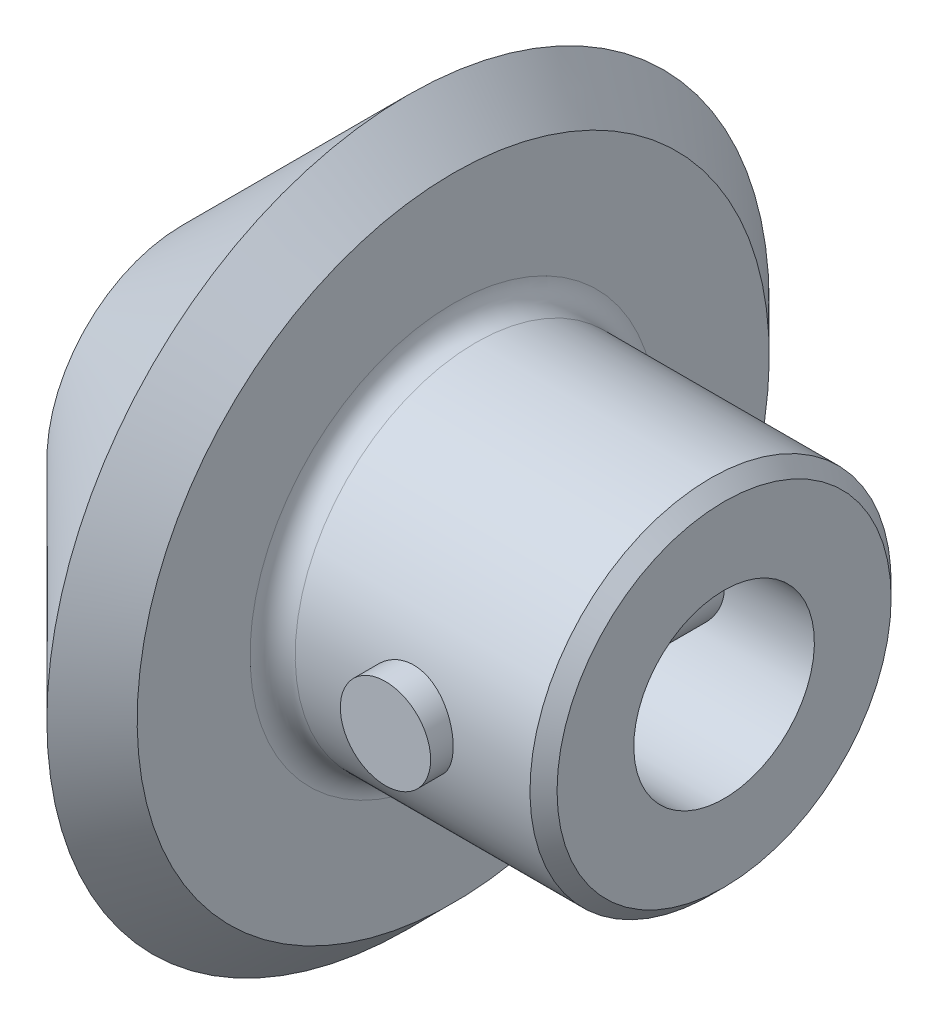
ISO-10303-21;
HEADER;
FILE_DESCRIPTION(('STEP AP214'),'2;1');
FILE_NAME('part.step','',(''),(''),'','','');
FILE_SCHEMA(('AUTOMOTIVE_DESIGN { 1 0 10303 214 1 1 1 1 }'));
ENDSEC;
DATA;
#1=APPLICATION_CONTEXT('core data for automotive mechanical design processes');
#2=APPLICATION_PROTOCOL_DEFINITION('international standard','automotive_design',2000,#1);
#3=PRODUCT_CONTEXT('',#1,'mechanical');
#4=PRODUCT('Part','Part','',(#3));
#5=PRODUCT_RELATED_PRODUCT_CATEGORY('part','',(#4));
#6=PRODUCT_DEFINITION_FORMATION('','',#4);
#7=PRODUCT_DEFINITION_CONTEXT('part definition',#1,'design');
#8=PRODUCT_DEFINITION('design','',#6,#7);
#9=PRODUCT_DEFINITION_SHAPE('','',#8);
#10=(LENGTH_UNIT() NAMED_UNIT(*) SI_UNIT(.MILLI.,.METRE.));
#11=(NAMED_UNIT(*) PLANE_ANGLE_UNIT() SI_UNIT($,.RADIAN.));
#12=(NAMED_UNIT(*) SI_UNIT($,.STERADIAN.) SOLID_ANGLE_UNIT());
#13=UNCERTAINTY_MEASURE_WITH_UNIT(LENGTH_MEASURE(1.E-05),#10,'distance_accuracy_value','');
#14=(GEOMETRIC_REPRESENTATION_CONTEXT(3) GLOBAL_UNCERTAINTY_ASSIGNED_CONTEXT((#13)) GLOBAL_UNIT_ASSIGNED_CONTEXT((#10,
#11,#12)) REPRESENTATION_CONTEXT('',''));
#15=CARTESIAN_POINT('',(0.,0.,0.));
#16=DIRECTION('',(0.,0.,1.));
#17=DIRECTION('',(1.,0.,0.));
#18=AXIS2_PLACEMENT_3D('',#15,#16,#17);
#19=CARTESIAN_POINT('',(9.,0.,4.5));
#20=DIRECTION('',(0.,0.,-1.));
#21=DIRECTION('',(-1.,0.,0.));
#22=AXIS2_PLACEMENT_3D('',#19,#20,#21);
#23=CYLINDRICAL_SURFACE('',#22,1.);
#24=CARTESIAN_POINT('',(9.,0.,4.5));
#25=DIRECTION('',(0.,0.,1.));
#26=DIRECTION('',(1.,0.,0.));
#27=AXIS2_PLACEMENT_3D('',#24,#25,#26);
#28=CIRCLE('',#27,1.);
#29=CARTESIAN_POINT('',(10.,0.,4.5));
#30=VERTEX_POINT('',#29);
#31=EDGE_CURVE('E11',#30,#30,#28,.T.);
#32=ORIENTED_EDGE('',*,*,#31,.F.);
#33=EDGE_LOOP('',(#32));
#34=FACE_BOUND('',#33,.T.);
#35=CARTESIAN_POINT('',(9.,0.,-4.5));
#36=DIRECTION('',(0.,0.,1.));
#37=DIRECTION('',(1.,0.,0.));
#38=AXIS2_PLACEMENT_3D('',#35,#36,#37);
#39=CIRCLE('',#38,1.);
#40=CARTESIAN_POINT('',(10.,0.,-4.5));
#41=VERTEX_POINT('',#40);
#42=EDGE_CURVE('E54',#41,#41,#39,.T.);
#43=ORIENTED_EDGE('',*,*,#42,.T.);
#44=EDGE_LOOP('',(#43));
#45=FACE_BOUND('',#44,.T.);
#46=ADVANCED_FACE('F51',(#34,#45),#23,.T.);
#47=CARTESIAN_POINT('',(9.,0.,4.5));
#48=DIRECTION('',(0.,0.,1.));
#49=DIRECTION('',(1.,0.,0.));
#50=AXIS2_PLACEMENT_3D('',#47,#48,#49);
#51=PLANE('',#50);
#52=ORIENTED_EDGE('',*,*,#31,.T.);
#53=EDGE_LOOP('',(#52));
#54=FACE_BOUND('',#53,.T.);
#55=ADVANCED_FACE('F66',(#54),#51,.T.);
#56=CARTESIAN_POINT('',(9.,0.,-4.5));
#57=DIRECTION('',(0.,0.,1.));
#58=DIRECTION('',(1.,0.,0.));
#59=AXIS2_PLACEMENT_3D('',#56,#57,#58);
#60=PLANE('',#59);
#61=ORIENTED_EDGE('',*,*,#42,.F.);
#62=EDGE_LOOP('',(#61));
#63=FACE_BOUND('',#62,.T.);
#64=ADVANCED_FACE('F64',(#63),#60,.F.);
#65=CLOSED_SHELL('',(#46,#55,#64));
#66=MANIFOLD_SOLID_BREP('B2',#65);
#67=CARTESIAN_POINT('',(0.,0.,0.));
#68=DIRECTION('',(-1.,0.,0.));
#69=DIRECTION('',(0.,-1.,0.));
#70=AXIS2_PLACEMENT_3D('',#67,#68,#69);
#71=PLANE('',#70);
#72=CARTESIAN_POINT('',(0.,0.,0.));
#73=DIRECTION('',(-1.,0.,0.));
#74=DIRECTION('',(0.,-1.,0.));
#75=AXIS2_PLACEMENT_3D('',#72,#73,#74);
#76=CIRCLE('',#75,1.5);
#77=CARTESIAN_POINT('',(0.,-1.5,0.));
#78=VERTEX_POINT('',#77);
#79=EDGE_CURVE('E222',#78,#78,#76,.T.);
#80=ORIENTED_EDGE('',*,*,#79,.F.);
#81=EDGE_LOOP('',(#80));
#82=FACE_BOUND('',#81,.T.);
#83=CARTESIAN_POINT('',(0.,0.,0.));
#84=DIRECTION('',(1.,0.,0.));
#85=DIRECTION('',(0.,1.,0.));
#86=AXIS2_PLACEMENT_3D('',#83,#84,#85);
#87=CIRCLE('',#86,3.00000000000002);
#88=CARTESIAN_POINT('',(0.,3.00000000000002,0.));
#89=VERTEX_POINT('',#88);
#90=EDGE_CURVE('E118',#89,#89,#87,.T.);
#91=ORIENTED_EDGE('',*,*,#90,.F.);
#92=EDGE_LOOP('',(#91));
#93=FACE_BOUND('',#92,.T.);
#94=ADVANCED_FACE('F97',(#82,#93),#71,.T.);
#95=CARTESIAN_POINT('',(5.,0.,0.));
#96=DIRECTION('',(1.,0.,0.));
#97=DIRECTION('',(0.,1.,0.));
#98=AXIS2_PLACEMENT_3D('',#95,#96,#97);
#99=CONICAL_SURFACE('',#98,8.,0.785398163397446);
#100=ORIENTED_EDGE('',*,*,#90,.T.);
#101=EDGE_LOOP('',(#100));
#102=FACE_BOUND('',#101,.T.);
#103=CARTESIAN_POINT('',(5.,0.,0.));
#104=DIRECTION('',(1.,0.,0.));
#105=DIRECTION('',(0.,1.,0.));
#106=AXIS2_PLACEMENT_3D('',#103,#104,#105);
#107=CIRCLE('',#106,8.);
#108=CARTESIAN_POINT('',(5.,8.,0.));
#109=VERTEX_POINT('',#108);
#110=EDGE_CURVE('E228',#109,#109,#107,.T.);
#111=ORIENTED_EDGE('',*,*,#110,.F.);
#112=EDGE_LOOP('',(#111));
#113=FACE_BOUND('',#112,.T.);
#114=ADVANCED_FACE('F176',(#102,#113),#99,.T.);
#115=CARTESIAN_POINT('',(6.,0.,0.));
#116=DIRECTION('',(-1.,0.,0.));
#117=DIRECTION('',(0.,-1.,0.));
#118=AXIS2_PLACEMENT_3D('',#115,#116,#117);
#119=CONICAL_SURFACE('',#118,7.,0.785398163397446);
#120=ORIENTED_EDGE('',*,*,#110,.T.);
#121=EDGE_LOOP('',(#120));
#122=FACE_BOUND('',#121,.T.);
#123=CARTESIAN_POINT('',(6.,0.,0.));
#124=DIRECTION('',(1.,0.,0.));
#125=DIRECTION('',(0.,1.,0.));
#126=AXIS2_PLACEMENT_3D('',#123,#124,#125);
#127=CIRCLE('',#126,7.);
#128=CARTESIAN_POINT('',(6.,7.,0.));
#129=VERTEX_POINT('',#128);
#130=EDGE_CURVE('E225',#129,#129,#127,.T.);
#131=ORIENTED_EDGE('',*,*,#130,.F.);
#132=EDGE_LOOP('',(#131));
#133=FACE_BOUND('',#132,.T.);
#134=ADVANCED_FACE('F172',(#122,#133),#119,.T.);
#135=CARTESIAN_POINT('',(6.,7.,0.));
#136=DIRECTION('',(1.,0.,0.));
#137=DIRECTION('',(0.,1.,0.));
#138=AXIS2_PLACEMENT_3D('',#135,#136,#137);
#139=PLANE('',#138);
#140=CARTESIAN_POINT('',(6.,0.,0.));
#141=DIRECTION('',(1.,0.,0.));
#142=DIRECTION('',(0.,1.,0.));
#143=AXIS2_PLACEMENT_3D('',#140,#141,#142);
#144=CIRCLE('',#143,4.5);
#145=CARTESIAN_POINT('',(6.,4.5,0.));
#146=VERTEX_POINT('',#145);
#147=EDGE_CURVE('E109',#146,#146,#144,.F.);
#148=ORIENTED_EDGE('',*,*,#147,.T.);
#149=EDGE_LOOP('',(#148));
#150=FACE_BOUND('',#149,.T.);
#151=ORIENTED_EDGE('',*,*,#130,.T.);
#152=EDGE_LOOP('',(#151));
#153=FACE_BOUND('',#152,.T.);
#154=ADVANCED_FACE('F168',(#150,#153),#139,.T.);
#155=CARTESIAN_POINT('',(10.,0.,0.));
#156=DIRECTION('',(-1.,0.,0.));
#157=DIRECTION('',(0.,-1.,0.));
#158=AXIS2_PLACEMENT_3D('',#155,#156,#157);
#159=CYLINDRICAL_SURFACE('',#158,1.5);
#160=CARTESIAN_POINT('',(6.,0.,0.));
#161=DIRECTION('',(1.,0.,0.));
#162=DIRECTION('',(0.,1.,0.));
#163=AXIS2_PLACEMENT_3D('',#160,#161,#162);
#164=CIRCLE('',#163,1.5);
#165=CARTESIAN_POINT('',(6.,1.5,0.));
#166=VERTEX_POINT('',#165);
#167=EDGE_CURVE('E218',#166,#166,#164,.F.);
#168=ORIENTED_EDGE('',*,*,#167,.F.);
#169=EDGE_LOOP('',(#168));
#170=FACE_BOUND('',#169,.T.);
#171=ORIENTED_EDGE('',*,*,#79,.T.);
#172=EDGE_LOOP('',(#171));
#173=FACE_BOUND('',#172,.T.);
#174=ADVANCED_FACE('F164',(#170,#173),#159,.F.);
#175=CARTESIAN_POINT('',(12.,0.,0.));
#176=DIRECTION('',(-1.,0.,0.));
#177=DIRECTION('',(0.,-1.,0.));
#178=AXIS2_PLACEMENT_3D('',#175,#176,#177);
#179=CYLINDRICAL_SURFACE('',#178,4.);
#180=CARTESIAN_POINT('',(11.7,0.,0.));
#181=DIRECTION('',(1.,0.,0.));
#182=DIRECTION('',(0.,1.,0.));
#183=AXIS2_PLACEMENT_3D('',#180,#181,#182);
#184=CIRCLE('',#183,4.);
#185=CARTESIAN_POINT('',(11.7,4.,0.));
#186=VERTEX_POINT('',#185);
#187=EDGE_CURVE('E50',#186,#186,#184,.F.);
#188=ORIENTED_EDGE('',*,*,#187,.T.);
#189=EDGE_LOOP('',(#188));
#190=FACE_BOUND('',#189,.T.);
#191=CARTESIAN_POINT('',(6.5,0.,0.));
#192=DIRECTION('',(1.,0.,0.));
#193=DIRECTION('',(0.,1.,0.));
#194=AXIS2_PLACEMENT_3D('',#191,#192,#193);
#195=CIRCLE('',#194,4.);
#196=CARTESIAN_POINT('',(6.5,4.,0.));
#197=VERTEX_POINT('',#196);
#198=EDGE_CURVE('E113',#197,#197,#195,.T.);
#199=ORIENTED_EDGE('',*,*,#198,.T.);
#200=EDGE_LOOP('',(#199));
#201=FACE_BOUND('',#200,.T.);
#202=CARTESIAN_POINT('',(10.,0.,-4.));
#203=CARTESIAN_POINT('',(9.9999984495079,0.0552507257798208,-3.99999906578675));
#204=CARTESIAN_POINT('',(9.99540563281748,0.110518771887176,-3.99884385421219));
#205=CARTESIAN_POINT('',(9.977183232462,0.219470882513689,-3.99434742553261));
#206=CARTESIAN_POINT('',(9.96354852697477,0.273154031247159,-3.99100496946646));
#207=CARTESIAN_POINT('',(9.92770716435861,0.377347248121718,-3.98250417554693));
#208=CARTESIAN_POINT('',(9.90551080085648,0.42786104228667,-3.97734801894725));
#209=CARTESIAN_POINT('',(9.85321240663678,0.524448087936285,-3.96576895871729));
#210=CARTESIAN_POINT('',(9.82311010925404,0.57052118956584,-3.95934601236034));
#211=CARTESIAN_POINT('',(9.75519947356386,0.657867951533947,-3.94578275727868));
#212=CARTESIAN_POINT('',(9.71725895002722,0.699037126707382,-3.93863138099022));
#213=CARTESIAN_POINT('',(9.63503186339406,0.774499284802204,-3.92449080078353));
#214=CARTESIAN_POINT('',(9.59074458470234,0.808791491299424,-3.91750161525566));
#215=CARTESIAN_POINT('',(9.49626984884171,0.870017695199356,-3.9043651713314));
#216=CARTESIAN_POINT('',(9.44600451279306,0.896834810616906,-3.89823196313737));
#217=CARTESIAN_POINT('',(9.34150105889443,0.941597939033686,-3.88766329874815));
#218=CARTESIAN_POINT('',(9.28726357778283,0.95954537029289,-3.88322757115192));
#219=CARTESIAN_POINT('',(9.17750433453168,0.985703224536195,-3.87666984478367));
#220=CARTESIAN_POINT('',(9.12203006930013,0.994101512222227,-3.87450327383617));
#221=CARTESIAN_POINT('',(9.01042095399068,1.00150785004524,-3.8725957502516));
#222=CARTESIAN_POINT('',(8.95428621286759,1.00051742787865,-3.87285440299096));
#223=CARTESIAN_POINT('',(8.84438946150368,0.989324349759522,-3.87572803664412));
#224=CARTESIAN_POINT('',(8.79060291902327,0.979345560127015,-3.87828575334586));
#225=CARTESIAN_POINT('',(8.68549263272581,0.950816124602073,-3.88537806450989));
#226=CARTESIAN_POINT('',(8.63416906464735,0.932264868046284,-3.88991279980464));
#227=CARTESIAN_POINT('',(8.53484132249863,0.886926318624771,-3.90050075936124));
#228=CARTESIAN_POINT('',(8.48687588547363,0.860057778155276,-3.90656884979614));
#229=CARTESIAN_POINT('',(8.39605419349544,0.798904184009971,-3.91953140564257));
#230=CARTESIAN_POINT('',(8.35319883462183,0.764617832539227,-3.9264260155649));
#231=CARTESIAN_POINT('',(8.2725309228704,0.688442283120812,-3.94050587026521));
#232=CARTESIAN_POINT('',(8.23489700662577,0.646364172110574,-3.94769379651981));
#233=CARTESIAN_POINT('',(8.1671858383574,0.556407945002467,-3.96137310385857));
#234=CARTESIAN_POINT('',(8.13710881715762,0.508529651805297,-3.96786446366277));
#235=CARTESIAN_POINT('',(8.08529960918374,0.408077259120929,-3.97945154729455));
#236=CARTESIAN_POINT('',(8.06359643983038,0.355487595472417,-3.9845424008515));
#237=CARTESIAN_POINT('',(8.02938846286028,0.247250672095256,-3.99271944660946));
#238=CARTESIAN_POINT('',(8.01688189572124,0.191603999433658,-3.99580602226187));
#239=CARTESIAN_POINT('',(8.00169495629411,0.0803599802600187,-3.9995699951425));
#240=CARTESIAN_POINT('',(7.9987713159498,0.0247978133254738,-4.00030702338852));
#241=CARTESIAN_POINT('',(8.00216600137032,-0.0860219165343384,-3.999458698763));
#242=CARTESIAN_POINT('',(8.00848349519942,-0.14127950642973,-3.99787355494564));
#243=CARTESIAN_POINT('',(8.02998060559425,-0.249076179184328,-3.99259720751571));
#244=CARTESIAN_POINT('',(8.04502750898466,-0.301643412645836,-3.98893756123874));
#245=CARTESIAN_POINT('',(8.08340472268563,-0.403504861635008,-3.97992471089423));
#246=CARTESIAN_POINT('',(8.10673586954211,-0.452798746021757,-3.97457133579928));
#247=CARTESIAN_POINT('',(8.16149075258315,-0.547682089619899,-3.96262205284207));
#248=CARTESIAN_POINT('',(8.19305074159784,-0.59319029455722,-3.95600578244621));
#249=CARTESIAN_POINT('',(8.26319327253131,-0.678351075762164,-3.94229672791613));
#250=CARTESIAN_POINT('',(8.30177702641127,-0.718002639315339,-3.93520386167803));
#251=CARTESIAN_POINT('',(8.38600130722964,-0.791327045381821,-3.92112637973847));
#252=CARTESIAN_POINT('',(8.43179180200162,-0.824829245081355,-3.91414869458187));
#253=CARTESIAN_POINT('',(8.52848842297715,-0.883673839341799,-3.90128585584826));
#254=CARTESIAN_POINT('',(8.57939432197317,-0.909016596105292,-3.89540065378017));
#255=CARTESIAN_POINT('',(8.68460381494205,-0.950634280406196,-3.88545396489777));
#256=CARTESIAN_POINT('',(8.73888508556267,-0.966962931102711,-3.88138170194604));
#257=CARTESIAN_POINT('',(8.84953975859274,-0.990230439969187,-3.87551162726789));
#258=CARTESIAN_POINT('',(8.90591270068833,-0.99717135165244,-3.87371331813291));
#259=CARTESIAN_POINT('',(9.01741401590347,-1.00135906022266,-3.87263267469304));
#260=CARTESIAN_POINT('',(9.07253162341649,-0.99887859852008,-3.87327955152176));
#261=CARTESIAN_POINT('',(9.18153592577866,-0.984918185541913,-3.87685272671895));
#262=CARTESIAN_POINT('',(9.23542264534244,-0.973438415124514,-3.87977897927904));
#263=CARTESIAN_POINT('',(9.34013897271027,-0.941954212961864,-3.88754173788482));
#264=CARTESIAN_POINT('',(9.39098487016014,-0.922000936453585,-3.89236676824206));
#265=CARTESIAN_POINT('',(9.4886435884758,-0.874176609070048,-3.90338503816552));
#266=CARTESIAN_POINT('',(9.53545584879128,-0.846304460022794,-3.90957846747182));
#267=CARTESIAN_POINT('',(9.62503641933468,-0.782578499091425,-3.92283756175675));
#268=CARTESIAN_POINT('',(9.66766738228264,-0.746535441941503,-3.92992176554505));
#269=CARTESIAN_POINT('',(9.74636469653028,-0.667859580793157,-3.94405351497524));
#270=CARTESIAN_POINT('',(9.78242948674198,-0.625225214174098,-3.95110105151373));
#271=CARTESIAN_POINT('',(9.84760753904307,-0.533645057801728,-3.96451770431775));
#272=CARTESIAN_POINT('',(9.87658307578105,-0.484598948210926,-3.97087222243912));
#273=CARTESIAN_POINT('',(9.92583164196036,-0.382177373006986,-3.98203283316746));
#274=CARTESIAN_POINT('',(9.94611090709903,-0.328805042291161,-3.98684003466521));
#275=CARTESIAN_POINT('',(9.97438122021977,-0.229606835495649,-3.99365373043694));
#276=CARTESIAN_POINT('',(9.98396749536896,-0.184253447272047,-3.9960172336846));
#277=CARTESIAN_POINT('',(9.99677729574796,-0.0926040476908561,-3.99919070154632));
#278=CARTESIAN_POINT('',(10.0000012995369,-0.0463081074950778,-4.00000078300596));
#279=CARTESIAN_POINT('',(10.,0.,-4.));
#280=B_SPLINE_CURVE_WITH_KNOTS('',3,(#202,#203,#204,#205,#206,#207,#208,#209,#210,#211,#212,
#213,#214,#215,#216,#217,#218,#219,#220,#221,#222,#223,#224,#225,#226,#227,#228,#229,#230,#231,
#232,#233,#234,#235,#236,#237,#238,#239,#240,#241,#242,#243,#244,#245,#246,#247,#248,#249,#250,
#251,#252,#253,#254,#255,#256,#257,#258,#259,#260,#261,#262,#263,#264,#265,#266,#267,#268,#269,
#270,#271,#272,#273,#274,#275,#276,#277,#278,#279),.UNSPECIFIED.,.T.,.F.,(4,2,2,2,2,2,2,2,2,2,2,
2,2,2,2,2,2,2,2,2,2,2,2,2,2,2,2,2,2,2,2,2,2,2,2,2,2,2,4),(0.,0.16558247498126,0.331258825175933,
0.496736601524071,0.662219960112886,0.830762902914261,0.999324863867081,1.17039098363871,
1.34142974112912,1.50904196732954,1.67662692075131,1.84014998004679,2.00368468977359,
2.16887018582586,2.33408460557442,2.50401000646013,2.67394059705498,2.84445486006076,
3.01493649125762,3.18105539299518,3.34715934075162,3.51080183009359,3.67446084881527,
3.84102391710235,4.0076157533868,4.17829672802985,4.34897012499673,4.51861503076025,
4.68822282168272,4.85295853599076,5.0176909397069,5.18144267039632,5.34521712091268,
5.51326384273274,5.68135046513613,5.85248123666393,6.02348909214234,6.16228161961434,
6.30106370695361),.UNSPECIFIED.);
#281=CARTESIAN_POINT('',(10.,0.,-4.));
#282=VERTEX_POINT('',#281);
#283=EDGE_CURVE('E154',#282,#282,#280,.T.);
#284=ORIENTED_EDGE('',*,*,#283,.T.);
#285=EDGE_LOOP('',(#284));
#286=FACE_BOUND('',#285,.T.);
#287=CARTESIAN_POINT('',(10.,0.,4.));
#288=CARTESIAN_POINT('',(9.9999984495079,-0.0552507257798208,3.99999906578675));
#289=CARTESIAN_POINT('',(9.99540563281748,-0.110518771887176,3.99884385421219));
#290=CARTESIAN_POINT('',(9.977183232462,-0.219470882513689,3.99434742553261));
#291=CARTESIAN_POINT('',(9.96354852697477,-0.273154031247159,3.99100496946646));
#292=CARTESIAN_POINT('',(9.92770716435861,-0.377347248121718,3.98250417554693));
#293=CARTESIAN_POINT('',(9.90551080085648,-0.42786104228667,3.97734801894725));
#294=CARTESIAN_POINT('',(9.85321240663678,-0.524448087936285,3.96576895871729));
#295=CARTESIAN_POINT('',(9.82311010925404,-0.57052118956584,3.95934601236034));
#296=CARTESIAN_POINT('',(9.75519947356386,-0.657867951533947,3.94578275727868));
#297=CARTESIAN_POINT('',(9.71725895002722,-0.699037126707382,3.93863138099022));
#298=CARTESIAN_POINT('',(9.63503186339406,-0.774499284802204,3.92449080078353));
#299=CARTESIAN_POINT('',(9.59074458470234,-0.808791491299424,3.91750161525566));
#300=CARTESIAN_POINT('',(9.49626984884171,-0.870017695199356,3.9043651713314));
#301=CARTESIAN_POINT('',(9.44600451279306,-0.896834810616906,3.89823196313737));
#302=CARTESIAN_POINT('',(9.34150105889443,-0.941597939033686,3.88766329874815));
#303=CARTESIAN_POINT('',(9.28726357778283,-0.95954537029289,3.88322757115192));
#304=CARTESIAN_POINT('',(9.17750433453168,-0.985703224536195,3.87666984478367));
#305=CARTESIAN_POINT('',(9.12203006930013,-0.994101512222227,3.87450327383617));
#306=CARTESIAN_POINT('',(9.01042095399068,-1.00150785004524,3.8725957502516));
#307=CARTESIAN_POINT('',(8.95428621286759,-1.00051742787865,3.87285440299096));
#308=CARTESIAN_POINT('',(8.84438946150368,-0.989324349759522,3.87572803664412));
#309=CARTESIAN_POINT('',(8.79060291902327,-0.979345560127015,3.87828575334586));
#310=CARTESIAN_POINT('',(8.68549263272581,-0.950816124602073,3.88537806450989));
#311=CARTESIAN_POINT('',(8.63416906464735,-0.932264868046284,3.88991279980464));
#312=CARTESIAN_POINT('',(8.53484132249863,-0.886926318624771,3.90050075936124));
#313=CARTESIAN_POINT('',(8.48687588547363,-0.860057778155276,3.90656884979614));
#314=CARTESIAN_POINT('',(8.39605419349544,-0.798904184009971,3.91953140564257));
#315=CARTESIAN_POINT('',(8.35319883462183,-0.764617832539227,3.9264260155649));
#316=CARTESIAN_POINT('',(8.2725309228704,-0.688442283120812,3.94050587026521));
#317=CARTESIAN_POINT('',(8.23489700662577,-0.646364172110574,3.94769379651981));
#318=CARTESIAN_POINT('',(8.1671858383574,-0.556407945002467,3.96137310385857));
#319=CARTESIAN_POINT('',(8.13710881715762,-0.508529651805297,3.96786446366277));
#320=CARTESIAN_POINT('',(8.08529960918374,-0.408077259120929,3.97945154729455));
#321=CARTESIAN_POINT('',(8.06359643983038,-0.355487595472417,3.9845424008515));
#322=CARTESIAN_POINT('',(8.02938846286028,-0.247250672095256,3.99271944660946));
#323=CARTESIAN_POINT('',(8.01688189572124,-0.191603999433658,3.99580602226187));
#324=CARTESIAN_POINT('',(8.00169495629411,-0.0803599802600187,3.9995699951425));
#325=CARTESIAN_POINT('',(7.9987713159498,-0.0247978133254738,4.00030702338852));
#326=CARTESIAN_POINT('',(8.00216600137032,0.0860219165343384,3.999458698763));
#327=CARTESIAN_POINT('',(8.00848349519942,0.14127950642973,3.99787355494564));
#328=CARTESIAN_POINT('',(8.02998060559425,0.249076179184328,3.99259720751571));
#329=CARTESIAN_POINT('',(8.04502750898466,0.301643412645836,3.98893756123874));
#330=CARTESIAN_POINT('',(8.08340472268563,0.403504861635008,3.97992471089423));
#331=CARTESIAN_POINT('',(8.10673586954211,0.452798746021757,3.97457133579928));
#332=CARTESIAN_POINT('',(8.16149075258315,0.547682089619899,3.96262205284207));
#333=CARTESIAN_POINT('',(8.19305074159784,0.59319029455722,3.95600578244621));
#334=CARTESIAN_POINT('',(8.26319327253131,0.678351075762164,3.94229672791613));
#335=CARTESIAN_POINT('',(8.30177702641127,0.718002639315339,3.93520386167803));
#336=CARTESIAN_POINT('',(8.38600130722964,0.791327045381821,3.92112637973847));
#337=CARTESIAN_POINT('',(8.43179180200162,0.824829245081355,3.91414869458187));
#338=CARTESIAN_POINT('',(8.52848842297715,0.883673839341799,3.90128585584826));
#339=CARTESIAN_POINT('',(8.57939432197317,0.909016596105292,3.89540065378017));
#340=CARTESIAN_POINT('',(8.68460381494205,0.950634280406196,3.88545396489777));
#341=CARTESIAN_POINT('',(8.73888508556267,0.966962931102711,3.88138170194604));
#342=CARTESIAN_POINT('',(8.84953975859274,0.990230439969187,3.87551162726789));
#343=CARTESIAN_POINT('',(8.90591270068833,0.99717135165244,3.87371331813291));
#344=CARTESIAN_POINT('',(9.01741401590347,1.00135906022266,3.87263267469304));
#345=CARTESIAN_POINT('',(9.07253162341649,0.99887859852008,3.87327955152176));
#346=CARTESIAN_POINT('',(9.18153592577866,0.984918185541913,3.87685272671895));
#347=CARTESIAN_POINT('',(9.23542264534244,0.973438415124514,3.87977897927904));
#348=CARTESIAN_POINT('',(9.34013897271027,0.941954212961864,3.88754173788482));
#349=CARTESIAN_POINT('',(9.39098487016014,0.922000936453585,3.89236676824206));
#350=CARTESIAN_POINT('',(9.4886435884758,0.874176609070048,3.90338503816552));
#351=CARTESIAN_POINT('',(9.53545584879128,0.846304460022794,3.90957846747182));
#352=CARTESIAN_POINT('',(9.62503641933468,0.782578499091425,3.92283756175675));
#353=CARTESIAN_POINT('',(9.66766738228264,0.746535441941503,3.92992176554505));
#354=CARTESIAN_POINT('',(9.74636469653028,0.667859580793157,3.94405351497524));
#355=CARTESIAN_POINT('',(9.78242948674198,0.625225214174098,3.95110105151373));
#356=CARTESIAN_POINT('',(9.84760753904307,0.533645057801728,3.96451770431775));
#357=CARTESIAN_POINT('',(9.87658307578105,0.484598948210926,3.97087222243912));
#358=CARTESIAN_POINT('',(9.92583164196036,0.382177373006986,3.98203283316746));
#359=CARTESIAN_POINT('',(9.94611090709903,0.328805042291161,3.98684003466521));
#360=CARTESIAN_POINT('',(9.97438122021977,0.229606835495649,3.99365373043694));
#361=CARTESIAN_POINT('',(9.98396749536896,0.184253447272047,3.9960172336846));
#362=CARTESIAN_POINT('',(9.99677729574796,0.0926040476908561,3.99919070154632));
#363=CARTESIAN_POINT('',(10.0000012995369,0.0463081074950778,4.00000078300596));
#364=CARTESIAN_POINT('',(10.,0.,4.));
#365=B_SPLINE_CURVE_WITH_KNOTS('',3,(#287,#288,#289,#290,#291,#292,#293,#294,#295,#296,#297,
#298,#299,#300,#301,#302,#303,#304,#305,#306,#307,#308,#309,#310,#311,#312,#313,#314,#315,#316,
#317,#318,#319,#320,#321,#322,#323,#324,#325,#326,#327,#328,#329,#330,#331,#332,#333,#334,#335,
#336,#337,#338,#339,#340,#341,#342,#343,#344,#345,#346,#347,#348,#349,#350,#351,#352,#353,#354,
#355,#356,#357,#358,#359,#360,#361,#362,#363,#364),.UNSPECIFIED.,.T.,.F.,(4,2,2,2,2,2,2,2,2,2,2,
2,2,2,2,2,2,2,2,2,2,2,2,2,2,2,2,2,2,2,2,2,2,2,2,2,2,2,4),(0.,0.16558247498126,0.331258825175933,
0.496736601524071,0.662219960112886,0.830762902914261,0.999324863867081,1.17039098363871,
1.34142974112912,1.50904196732954,1.67662692075131,1.84014998004679,2.00368468977359,
2.16887018582586,2.33408460557442,2.50401000646013,2.67394059705498,2.84445486006076,
3.01493649125762,3.18105539299518,3.34715934075162,3.51080183009359,3.67446084881527,
3.84102391710235,4.0076157533868,4.17829672802985,4.34897012499673,4.51861503076025,
4.68822282168272,4.85295853599076,5.0176909397069,5.18144267039632,5.34521712091268,
5.51326384273274,5.68135046513613,5.85248123666393,6.02348909214234,6.16228161961434,
6.30106370695361),.UNSPECIFIED.);
#366=CARTESIAN_POINT('',(10.,0.,4.));
#367=VERTEX_POINT('',#366);
#368=EDGE_CURVE('E127',#367,#367,#365,.T.);
#369=ORIENTED_EDGE('',*,*,#368,.T.);
#370=EDGE_LOOP('',(#369));
#371=FACE_BOUND('',#370,.T.);
#372=ADVANCED_FACE('F159',(#190,#201,#286,#371),#179,.T.);
#373=CARTESIAN_POINT('',(12.,0.,0.));
#374=DIRECTION('',(1.,0.,0.));
#375=DIRECTION('',(0.,1.,0.));
#376=AXIS2_PLACEMENT_3D('',#373,#374,#375);
#377=PLANE('',#376);
#378=CARTESIAN_POINT('',(12.,0.,0.));
#379=DIRECTION('',(1.,0.,0.));
#380=DIRECTION('',(0.,1.,0.));
#381=AXIS2_PLACEMENT_3D('',#378,#379,#380);
#382=CIRCLE('',#381,3.70000000000001);
#383=CARTESIAN_POINT('',(12.,3.70000000000001,0.));
#384=VERTEX_POINT('',#383);
#385=EDGE_CURVE('E105',#384,#384,#382,.T.);
#386=ORIENTED_EDGE('',*,*,#385,.T.);
#387=EDGE_LOOP('',(#386));
#388=FACE_BOUND('',#387,.T.);
#389=CARTESIAN_POINT('',(12.,0.,0.));
#390=DIRECTION('',(1.,0.,0.));
#391=DIRECTION('',(0.,1.,0.));
#392=AXIS2_PLACEMENT_3D('',#389,#390,#391);
#393=CIRCLE('',#392,2.);
#394=CARTESIAN_POINT('',(12.,2.,0.));
#395=VERTEX_POINT('',#394);
#396=EDGE_CURVE('E215',#395,#395,#393,.T.);
#397=ORIENTED_EDGE('',*,*,#396,.F.);
#398=EDGE_LOOP('',(#397));
#399=FACE_BOUND('',#398,.T.);
#400=ADVANCED_FACE('F163',(#388,#399),#377,.T.);
#401=CARTESIAN_POINT('',(6.,0.,0.));
#402=DIRECTION('',(1.,0.,0.));
#403=DIRECTION('',(0.,1.,0.));
#404=AXIS2_PLACEMENT_3D('',#401,#402,#403);
#405=PLANE('',#404);
#406=CARTESIAN_POINT('',(6.,0.,0.));
#407=DIRECTION('',(1.,0.,0.));
#408=DIRECTION('',(0.,1.,0.));
#409=AXIS2_PLACEMENT_3D('',#406,#407,#408);
#410=CIRCLE('',#409,2.);
#411=CARTESIAN_POINT('',(6.,2.,0.));
#412=VERTEX_POINT('',#411);
#413=EDGE_CURVE('E212',#412,#412,#410,.T.);
#414=ORIENTED_EDGE('',*,*,#413,.T.);
#415=EDGE_LOOP('',(#414));
#416=FACE_BOUND('',#415,.T.);
#417=ORIENTED_EDGE('',*,*,#167,.T.);
#418=EDGE_LOOP('',(#417));
#419=FACE_BOUND('',#418,.T.);
#420=ADVANCED_FACE('F143',(#416,#419),#405,.T.);
#421=CARTESIAN_POINT('',(6.,0.,0.));
#422=DIRECTION('',(1.,0.,0.));
#423=DIRECTION('',(0.,1.,0.));
#424=AXIS2_PLACEMENT_3D('',#421,#422,#423);
#425=CYLINDRICAL_SURFACE('',#424,2.);
#426=CARTESIAN_POINT('',(10.,0.,-2.));
#427=CARTESIAN_POINT('',(9.9999966976805,-0.0525719629529866,-1.99999713404151));
#428=CARTESIAN_POINT('',(9.99582992687833,-0.105206599698033,-1.99790491019518));
#429=CARTESIAN_POINT('',(9.97934711965909,-0.208920235268425,-1.98974156037396));
#430=CARTESIAN_POINT('',(9.96701560700235,-0.259996086713504,-1.98366287828984));
#431=CARTESIAN_POINT('',(9.93480619138321,-0.358933544880575,-1.96816279403312));
#432=CARTESIAN_POINT('',(9.91495761575199,-0.40680680293918,-1.9587543917752));
#433=CARTESIAN_POINT('',(9.86842937863506,-0.498472616806565,-1.93745776515779));
#434=CARTESIAN_POINT('',(9.84175025575115,-0.54226549399005,-1.9255697363353));
#435=CARTESIAN_POINT('',(9.7804827505147,-0.62750781776192,-1.89956258258057));
#436=CARTESIAN_POINT('',(9.74551352076036,-0.668655211122113,-1.88535199127536));
#437=CARTESIAN_POINT('',(9.66947852075297,-0.744779444866978,-1.85659970246744));
#438=CARTESIAN_POINT('',(9.62840814822756,-0.779751583106767,-1.84205776209035));
#439=CARTESIAN_POINT('',(9.53751665047662,-0.845252000450279,-1.81298951197347));
#440=CARTESIAN_POINT('',(9.48726390165409,-0.875225335551638,-1.79855186970132));
#441=CARTESIAN_POINT('',(9.38163266401379,-0.926168226890697,-1.7728597877232));
#442=CARTESIAN_POINT('',(9.32625787127725,-0.947144214966335,-1.7616030760699));
#443=CARTESIAN_POINT('',(9.21533489457808,-0.97813244218859,-1.74457867037808));
#444=CARTESIAN_POINT('',(9.15999554793261,-0.988725857080443,-1.73852271583713));
#445=CARTESIAN_POINT('',(9.04802116222052,-1.00042699330885,-1.73181889948528));
#446=CARTESIAN_POINT('',(8.99138745912885,-1.00154408837308,-1.73116569343288));
#447=CARTESIAN_POINT('',(8.88571397568463,-0.994687287172296,-1.73510930257248));
#448=CARTESIAN_POINT('',(8.83657596877695,-0.987784559536823,-1.73908763662013));
#449=CARTESIAN_POINT('',(8.74027809062696,-0.966939849056934,-1.7507622873385));
#450=CARTESIAN_POINT('',(8.69311885469468,-0.952995623897653,-1.75845978831776));
#451=CARTESIAN_POINT('',(8.60077086743434,-0.918209780386005,-1.77687476412741));
#452=CARTESIAN_POINT('',(8.55565360121421,-0.897215067115996,-1.78765840663998));
#453=CARTESIAN_POINT('',(8.46936570740999,-0.849041687668004,-1.81103404281404));
#454=CARTESIAN_POINT('',(8.42819686439991,-0.821860243812469,-1.8236268478019));
#455=CARTESIAN_POINT('',(8.34547874725677,-0.75806605491279,-1.85113157903286));
#456=CARTESIAN_POINT('',(8.30454312642384,-0.720694458369283,-1.86613510236746));
#457=CARTESIAN_POINT('',(8.2292645814091,-0.639555578741375,-1.89547623300407));
#458=CARTESIAN_POINT('',(8.19492480796612,-0.595785256574287,-1.90981351958801));
#459=CARTESIAN_POINT('',(8.13231433897027,-0.50051650583185,-1.93701987282964));
#460=CARTESIAN_POINT('',(8.10439952755426,-0.44875359159941,-1.94978984162007));
#461=CARTESIAN_POINT('',(8.05790297095699,-0.340466215488798,-1.97157881121242));
#462=CARTESIAN_POINT('',(8.03931381498483,-0.283945576265278,-1.98060078943553));
#463=CARTESIAN_POINT('',(8.01352459628332,-0.172766491660703,-1.99324333741436));
#464=CARTESIAN_POINT('',(8.00550876425322,-0.118341530548326,-1.99724938301312));
#465=CARTESIAN_POINT('',(7.99853526886551,-0.0087795999493547,-2.00073013459102));
#466=CARTESIAN_POINT('',(7.99957331436052,0.0463570198699005,-2.00020698721312));
#467=CARTESIAN_POINT('',(8.01020668841875,0.151232971985993,-1.99491192253441));
#468=CARTESIAN_POINT('',(8.01913253273003,0.201059408049953,-1.9904724568819));
#469=CARTESIAN_POINT('',(8.04423807189509,0.298406892301916,-1.97822171314819));
#470=CARTESIAN_POINT('',(8.06041856645336,0.345927685690997,-1.97041006334333));
#471=CARTESIAN_POINT('',(8.09999846643317,0.438888608449665,-1.95184251413669));
#472=CARTESIAN_POINT('',(8.12359105011681,0.484230397006154,-1.94100881769939));
#473=CARTESIAN_POINT('',(8.17710753564604,0.570461361698921,-1.91743974317109));
#474=CARTESIAN_POINT('',(8.20703413459343,0.611348629775282,-1.90470355565785));
#475=CARTESIAN_POINT('',(8.27576042533287,0.691767689290654,-1.87708221337464));
#476=CARTESIAN_POINT('',(8.31514286845356,0.730772077824639,-1.86210884848441));
#477=CARTESIAN_POINT('',(8.3999251512693,0.80185632111324,-1.83262391603874));
#478=CARTESIAN_POINT('',(8.44532911881637,0.833931385690842,-1.81811267381526));
#479=CARTESIAN_POINT('',(8.54364365420031,0.891707914497696,-1.79051192226068));
#480=CARTESIAN_POINT('',(8.59681126620859,0.917025495878638,-1.77752529663472));
#481=CARTESIAN_POINT('',(8.70751006769252,0.958082826013804,-1.75574072368126));
#482=CARTESIAN_POINT('',(8.76503552650119,0.973834915887571,-1.74693738240618));
#483=CARTESIAN_POINT('',(8.87691022286145,0.993861687449681,-1.73561501008667));
#484=CARTESIAN_POINT('',(8.93103425342904,0.999092996400866,-1.73257383460491));
#485=CARTESIAN_POINT('',(9.03944706717073,1.00068915438079,-1.73165354646175));
#486=CARTESIAN_POINT('',(9.09373576873943,0.9970578466244,-1.73377219627553));
#487=CARTESIAN_POINT('',(9.19548350153202,0.981926125592264,-1.74237862050025));
#488=CARTESIAN_POINT('',(9.2431004701444,0.971208314342801,-1.74843094482394));
#489=CARTESIAN_POINT('',(9.33580811942471,0.943175358224646,-1.76371016187917));
#490=CARTESIAN_POINT('',(9.38089798209197,0.925858091159812,-1.77293807569676));
#491=CARTESIAN_POINT('',(9.47062485098661,0.883815745300685,-1.79428530364528));
#492=CARTESIAN_POINT('',(9.5150279018297,0.85867113781646,-1.80655722396191));
#493=CARTESIAN_POINT('',(9.59927453618059,0.802150971636636,-1.8323533163459));
#494=CARTESIAN_POINT('',(9.63911573051849,0.77077217123865,-1.84587813794522));
#495=CARTESIAN_POINT('',(9.71814198235762,0.698203326664643,-1.87462323159313));
#496=CARTESIAN_POINT('',(9.75665910236192,0.656284423010173,-1.88984983311469));
#497=CARTESIAN_POINT('',(9.82626298342363,0.566154806220281,-1.91877752255088));
#498=CARTESIAN_POINT('',(9.85734573942629,0.517940723256786,-1.9324777860804));
#499=CARTESIAN_POINT('',(9.91123636276221,0.415931596819948,-1.95698009585103));
#500=CARTESIAN_POINT('',(9.93398416941144,0.362099503934616,-1.96776096562909));
#501=CARTESIAN_POINT('',(9.96980816791896,0.250742101294192,-1.98501341363465));
#502=CARTESIAN_POINT('',(9.98291184682958,0.193227799623167,-1.99149723372932));
#503=CARTESIAN_POINT('',(9.99389741107585,0.112601946483385,-1.99695461909663));
#504=CARTESIAN_POINT('',(9.99618264086362,0.0901618794394997,-1.99809365339202));
#505=CARTESIAN_POINT('',(9.99923466551681,0.0451517318071583,-1.99961696977865));
#506=CARTESIAN_POINT('',(10.0000014184712,0.0225816476473817,-2.00000123103763));
#507=CARTESIAN_POINT('',(10.,0.,-2.));
#508=B_SPLINE_CURVE_WITH_KNOTS('',3,(#426,#427,#428,#429,#430,#431,#432,#433,#434,#435,#436,
#437,#438,#439,#440,#441,#442,#443,#444,#445,#446,#447,#448,#449,#450,#451,#452,#453,#454,#455,
#456,#457,#458,#459,#460,#461,#462,#463,#464,#465,#466,#467,#468,#469,#470,#471,#472,#473,#474,
#475,#476,#477,#478,#479,#480,#481,#482,#483,#484,#485,#486,#487,#488,#489,#490,#491,#492,#493,
#494,#495,#496,#497,#498,#499,#500,#501,#502,#503,#504,#505,#506,#507),.UNSPECIFIED.,.T.,.F.,(4,
2,2,2,2,2,2,2,2,2,2,2,2,2,2,2,2,2,2,2,2,2,2,2,2,2,2,2,2,2,2,2,2,2,2,2,2,2,2,2,4),(0.,
0.157624257420293,0.315548149709198,0.472862155492298,0.630163760581568,0.79698175871809,
0.963926237654036,1.14381726430753,1.32357947898281,1.4925801214023,1.66141357329021,
1.81005712409321,1.95874803925679,2.11090240168488,2.26312521260222,2.43464941333879,
2.60625534598687,2.78583022214441,2.9652621691228,3.12983290471346,3.29432564511476,
3.44606906506122,3.59782921630932,3.75392856027899,3.9100945074834,4.08159610644419,
4.25321588615432,4.43314682159674,4.61284511940778,4.77529307498374,4.93767059860006,
5.08457930244183,5.23153528783679,5.38836456775615,5.54527561138958,5.72125242752499,
5.89732383376573,6.07464013662926,6.25144908624931,6.31915280137698,6.38685838514848),.UNSPECIFIED.);
#509=CARTESIAN_POINT('',(10.,0.,-2.));
#510=VERTEX_POINT('',#509);
#511=EDGE_CURVE('E119',#510,#510,#508,.T.);
#512=ORIENTED_EDGE('',*,*,#511,.T.);
#513=EDGE_LOOP('',(#512));
#514=FACE_BOUND('',#513,.T.);
#515=CARTESIAN_POINT('',(10.,0.,2.));
#516=CARTESIAN_POINT('',(9.9999966976805,0.0525719629529866,1.99999713404151));
#517=CARTESIAN_POINT('',(9.99582992687833,0.105206599698033,1.99790491019518));
#518=CARTESIAN_POINT('',(9.97934711965909,0.208920235268425,1.98974156037396));
#519=CARTESIAN_POINT('',(9.96701560700235,0.259996086713504,1.98366287828984));
#520=CARTESIAN_POINT('',(9.93480619138321,0.358933544880575,1.96816279403312));
#521=CARTESIAN_POINT('',(9.91495761575199,0.40680680293918,1.9587543917752));
#522=CARTESIAN_POINT('',(9.86842937863506,0.498472616806565,1.93745776515779));
#523=CARTESIAN_POINT('',(9.84175025575115,0.54226549399005,1.9255697363353));
#524=CARTESIAN_POINT('',(9.7804827505147,0.62750781776192,1.89956258258057));
#525=CARTESIAN_POINT('',(9.74551352076036,0.668655211122113,1.88535199127536));
#526=CARTESIAN_POINT('',(9.66947852075297,0.744779444866978,1.85659970246744));
#527=CARTESIAN_POINT('',(9.62840814822756,0.779751583106767,1.84205776209035));
#528=CARTESIAN_POINT('',(9.53751665047662,0.845252000450279,1.81298951197347));
#529=CARTESIAN_POINT('',(9.48726390165409,0.875225335551638,1.79855186970132));
#530=CARTESIAN_POINT('',(9.38163266401379,0.926168226890697,1.7728597877232));
#531=CARTESIAN_POINT('',(9.32625787127725,0.947144214966335,1.7616030760699));
#532=CARTESIAN_POINT('',(9.21533489457808,0.97813244218859,1.74457867037808));
#533=CARTESIAN_POINT('',(9.15999554793261,0.988725857080443,1.73852271583713));
#534=CARTESIAN_POINT('',(9.04802116222052,1.00042699330885,1.73181889948528));
#535=CARTESIAN_POINT('',(8.99138745912885,1.00154408837308,1.73116569343288));
#536=CARTESIAN_POINT('',(8.88571397568463,0.994687287172296,1.73510930257248));
#537=CARTESIAN_POINT('',(8.83657596877695,0.987784559536823,1.73908763662013));
#538=CARTESIAN_POINT('',(8.74027809062696,0.966939849056934,1.7507622873385));
#539=CARTESIAN_POINT('',(8.69311885469468,0.952995623897653,1.75845978831776));
#540=CARTESIAN_POINT('',(8.60077086743434,0.918209780386005,1.77687476412741));
#541=CARTESIAN_POINT('',(8.55565360121421,0.897215067115996,1.78765840663998));
#542=CARTESIAN_POINT('',(8.46936570740999,0.849041687668004,1.81103404281404));
#543=CARTESIAN_POINT('',(8.42819686439991,0.821860243812469,1.8236268478019));
#544=CARTESIAN_POINT('',(8.34547874725677,0.75806605491279,1.85113157903286));
#545=CARTESIAN_POINT('',(8.30454312642384,0.720694458369283,1.86613510236746));
#546=CARTESIAN_POINT('',(8.2292645814091,0.639555578741375,1.89547623300407));
#547=CARTESIAN_POINT('',(8.19492480796612,0.595785256574287,1.90981351958801));
#548=CARTESIAN_POINT('',(8.13231433897027,0.50051650583185,1.93701987282964));
#549=CARTESIAN_POINT('',(8.10439952755426,0.44875359159941,1.94978984162007));
#550=CARTESIAN_POINT('',(8.05790297095699,0.340466215488798,1.97157881121242));
#551=CARTESIAN_POINT('',(8.03931381498483,0.283945576265278,1.98060078943553));
#552=CARTESIAN_POINT('',(8.01352459628332,0.172766491660703,1.99324333741436));
#553=CARTESIAN_POINT('',(8.00550876425322,0.118341530548326,1.99724938301312));
#554=CARTESIAN_POINT('',(7.99853526886551,0.0087795999493547,2.00073013459102));
#555=CARTESIAN_POINT('',(7.99957331436052,-0.0463570198699005,2.00020698721312));
#556=CARTESIAN_POINT('',(8.01020668841875,-0.151232971985993,1.99491192253441));
#557=CARTESIAN_POINT('',(8.01913253273003,-0.201059408049953,1.9904724568819));
#558=CARTESIAN_POINT('',(8.04423807189509,-0.298406892301916,1.97822171314819));
#559=CARTESIAN_POINT('',(8.06041856645336,-0.345927685690997,1.97041006334333));
#560=CARTESIAN_POINT('',(8.09999846643317,-0.438888608449665,1.95184251413669));
#561=CARTESIAN_POINT('',(8.12359105011681,-0.484230397006154,1.94100881769939));
#562=CARTESIAN_POINT('',(8.17710753564604,-0.570461361698921,1.91743974317109));
#563=CARTESIAN_POINT('',(8.20703413459343,-0.611348629775282,1.90470355565785));
#564=CARTESIAN_POINT('',(8.27576042533287,-0.691767689290654,1.87708221337464));
#565=CARTESIAN_POINT('',(8.31514286845356,-0.730772077824639,1.86210884848441));
#566=CARTESIAN_POINT('',(8.3999251512693,-0.80185632111324,1.83262391603874));
#567=CARTESIAN_POINT('',(8.44532911881637,-0.833931385690842,1.81811267381526));
#568=CARTESIAN_POINT('',(8.54364365420031,-0.891707914497696,1.79051192226068));
#569=CARTESIAN_POINT('',(8.59681126620859,-0.917025495878638,1.77752529663472));
#570=CARTESIAN_POINT('',(8.70751006769252,-0.958082826013804,1.75574072368126));
#571=CARTESIAN_POINT('',(8.76503552650119,-0.973834915887571,1.74693738240618));
#572=CARTESIAN_POINT('',(8.87691022286145,-0.993861687449681,1.73561501008667));
#573=CARTESIAN_POINT('',(8.93103425342904,-0.999092996400866,1.73257383460491));
#574=CARTESIAN_POINT('',(9.03944706717073,-1.00068915438079,1.73165354646175));
#575=CARTESIAN_POINT('',(9.09373576873943,-0.9970578466244,1.73377219627553));
#576=CARTESIAN_POINT('',(9.19548350153202,-0.981926125592264,1.74237862050025));
#577=CARTESIAN_POINT('',(9.2431004701444,-0.971208314342801,1.74843094482394));
#578=CARTESIAN_POINT('',(9.33580811942471,-0.943175358224646,1.76371016187917));
#579=CARTESIAN_POINT('',(9.38089798209197,-0.925858091159812,1.77293807569676));
#580=CARTESIAN_POINT('',(9.47062485098661,-0.883815745300685,1.79428530364528));
#581=CARTESIAN_POINT('',(9.5150279018297,-0.85867113781646,1.80655722396191));
#582=CARTESIAN_POINT('',(9.59927453618059,-0.802150971636636,1.8323533163459));
#583=CARTESIAN_POINT('',(9.63911573051849,-0.77077217123865,1.84587813794522));
#584=CARTESIAN_POINT('',(9.71814198235762,-0.698203326664643,1.87462323159313));
#585=CARTESIAN_POINT('',(9.75665910236192,-0.656284423010173,1.88984983311469));
#586=CARTESIAN_POINT('',(9.82626298342363,-0.566154806220281,1.91877752255088));
#587=CARTESIAN_POINT('',(9.85734573942629,-0.517940723256786,1.9324777860804));
#588=CARTESIAN_POINT('',(9.91123636276221,-0.415931596819948,1.95698009585103));
#589=CARTESIAN_POINT('',(9.93398416941144,-0.362099503934616,1.96776096562909));
#590=CARTESIAN_POINT('',(9.96980816791896,-0.250742101294192,1.98501341363465));
#591=CARTESIAN_POINT('',(9.98291184682958,-0.193227799623167,1.99149723372932));
#592=CARTESIAN_POINT('',(9.99389741107585,-0.112601946483385,1.99695461909663));
#593=CARTESIAN_POINT('',(9.99618264086362,-0.0901618794394997,1.99809365339202));
#594=CARTESIAN_POINT('',(9.99923466551681,-0.0451517318071583,1.99961696977865));
#595=CARTESIAN_POINT('',(10.0000014184712,-0.0225816476473817,2.00000123103763));
#596=CARTESIAN_POINT('',(10.,0.,2.));
#597=B_SPLINE_CURVE_WITH_KNOTS('',3,(#515,#516,#517,#518,#519,#520,#521,#522,#523,#524,#525,
#526,#527,#528,#529,#530,#531,#532,#533,#534,#535,#536,#537,#538,#539,#540,#541,#542,#543,#544,
#545,#546,#547,#548,#549,#550,#551,#552,#553,#554,#555,#556,#557,#558,#559,#560,#561,#562,#563,
#564,#565,#566,#567,#568,#569,#570,#571,#572,#573,#574,#575,#576,#577,#578,#579,#580,#581,#582,
#583,#584,#585,#586,#587,#588,#589,#590,#591,#592,#593,#594,#595,#596),.UNSPECIFIED.,.T.,.F.,(4,
2,2,2,2,2,2,2,2,2,2,2,2,2,2,2,2,2,2,2,2,2,2,2,2,2,2,2,2,2,2,2,2,2,2,2,2,2,2,2,4),(0.,
0.157624257420293,0.315548149709198,0.472862155492298,0.630163760581568,0.79698175871809,
0.963926237654036,1.14381726430753,1.32357947898281,1.4925801214023,1.66141357329021,
1.81005712409321,1.95874803925679,2.11090240168488,2.26312521260222,2.43464941333879,
2.60625534598687,2.78583022214441,2.9652621691228,3.12983290471346,3.29432564511476,
3.44606906506122,3.59782921630932,3.75392856027899,3.9100945074834,4.08159610644419,
4.25321588615432,4.43314682159674,4.61284511940778,4.77529307498374,4.93767059860006,
5.08457930244183,5.23153528783679,5.38836456775615,5.54527561138958,5.72125242752499,
5.89732383376573,6.07464013662926,6.25144908624931,6.31915280137698,6.38685838514848),.UNSPECIFIED.);
#598=CARTESIAN_POINT('',(10.,0.,2.));
#599=VERTEX_POINT('',#598);
#600=EDGE_CURVE('E128',#599,#599,#597,.T.);
#601=ORIENTED_EDGE('',*,*,#600,.T.);
#602=EDGE_LOOP('',(#601));
#603=FACE_BOUND('',#602,.T.);
#604=ORIENTED_EDGE('',*,*,#413,.F.);
#605=EDGE_LOOP('',(#604));
#606=FACE_BOUND('',#605,.T.);
#607=ORIENTED_EDGE('',*,*,#396,.T.);
#608=EDGE_LOOP('',(#607));
#609=FACE_BOUND('',#608,.T.);
#610=ADVANCED_FACE('F133',(#514,#603,#606,#609),#425,.F.);
#611=CARTESIAN_POINT('',(9.,0.,-8.));
#612=DIRECTION('',(0.,0.,1.));
#613=DIRECTION('',(1.,0.,0.));
#614=AXIS2_PLACEMENT_3D('',#611,#612,#613);
#615=CYLINDRICAL_SURFACE('',#614,1.);
#616=ORIENTED_EDGE('',*,*,#600,.F.);
#617=EDGE_LOOP('',(#616));
#618=FACE_BOUND('',#617,.T.);
#619=ORIENTED_EDGE('',*,*,#368,.F.);
#620=EDGE_LOOP('',(#619));
#621=FACE_BOUND('',#620,.T.);
#622=ADVANCED_FACE('F141',(#618,#621),#615,.F.);
#623=ORIENTED_EDGE('',*,*,#511,.F.);
#624=EDGE_LOOP('',(#623));
#625=FACE_BOUND('',#624,.T.);
#626=ORIENTED_EDGE('',*,*,#283,.F.);
#627=EDGE_LOOP('',(#626));
#628=FACE_BOUND('',#627,.T.);
#629=ADVANCED_FACE('F137',(#625,#628),#615,.F.);
#630=CARTESIAN_POINT('',(6.5,0.,0.));
#631=DIRECTION('',(1.,0.,0.));
#632=DIRECTION('',(0.,1.,0.));
#633=AXIS2_PLACEMENT_3D('',#630,#631,#632);
#634=TOROIDAL_SURFACE('',#633,4.5,0.5);
#635=ORIENTED_EDGE('',*,*,#147,.F.);
#636=EDGE_LOOP('',(#635));
#637=FACE_BOUND('',#636,.T.);
#638=ORIENTED_EDGE('',*,*,#198,.F.);
#639=EDGE_LOOP('',(#638));
#640=FACE_BOUND('',#639,.T.);
#641=ADVANCED_FACE('F140',(#637,#640),#634,.F.);
#642=CARTESIAN_POINT('',(12.,0.,0.));
#643=DIRECTION('',(-1.,0.,0.));
#644=DIRECTION('',(0.,-1.,0.));
#645=AXIS2_PLACEMENT_3D('',#642,#643,#644);
#646=CONICAL_SURFACE('',#645,3.70000000000001,0.785398163397448);
#647=ORIENTED_EDGE('',*,*,#187,.F.);
#648=EDGE_LOOP('',(#647));
#649=FACE_BOUND('',#648,.T.);
#650=ORIENTED_EDGE('',*,*,#385,.F.);
#651=EDGE_LOOP('',(#650));
#652=FACE_BOUND('',#651,.T.);
#653=ADVANCED_FACE('F100',(#649,#652),#646,.T.);
#654=CLOSED_SHELL('',(#94,#114,#134,#154,#174,#372,#400,#420,#610,#622,#629,#641,#653));
#655=MANIFOLD_SOLID_BREP('B6',#654);
#656=ADVANCED_BREP_SHAPE_REPRESENTATION('',(#18,#66,#655),#14);
#657=SHAPE_DEFINITION_REPRESENTATION(#9,#656);
ENDSEC;
END-ISO-10303-21;
